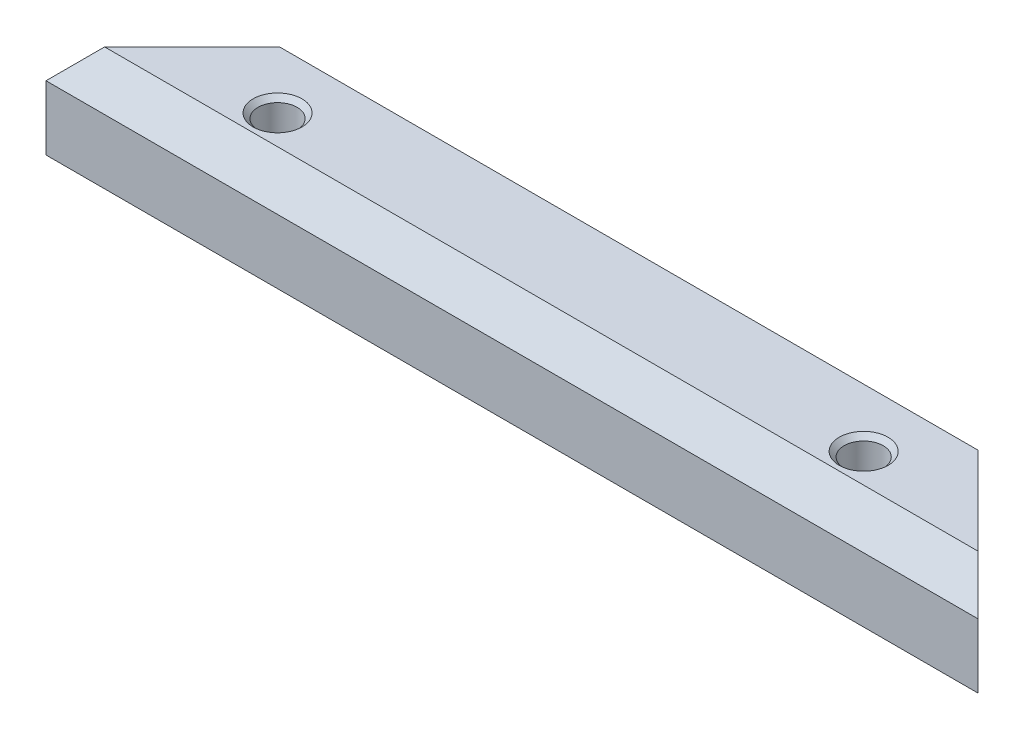
ISO-10303-21;
HEADER;
FILE_DESCRIPTION(('STEP AP214'),'2;1');
FILE_NAME('part.step','',(''),(''),'','','');
FILE_SCHEMA(('AUTOMOTIVE_DESIGN { 1 0 10303 214 1 1 1 1 }'));
ENDSEC;
DATA;
#1=APPLICATION_CONTEXT('core data for automotive mechanical design processes');
#2=APPLICATION_PROTOCOL_DEFINITION('international standard','automotive_design',2000,#1);
#3=PRODUCT_CONTEXT('',#1,'mechanical');
#4=PRODUCT('Part','Part','',(#3));
#5=PRODUCT_RELATED_PRODUCT_CATEGORY('part','',(#4));
#6=PRODUCT_DEFINITION_FORMATION('','',#4);
#7=PRODUCT_DEFINITION_CONTEXT('part definition',#1,'design');
#8=PRODUCT_DEFINITION('design','',#6,#7);
#9=PRODUCT_DEFINITION_SHAPE('','',#8);
#10=(LENGTH_UNIT() NAMED_UNIT(*) SI_UNIT(.MILLI.,.METRE.));
#11=(NAMED_UNIT(*) PLANE_ANGLE_UNIT() SI_UNIT($,.RADIAN.));
#12=(NAMED_UNIT(*) SI_UNIT($,.STERADIAN.) SOLID_ANGLE_UNIT());
#13=UNCERTAINTY_MEASURE_WITH_UNIT(LENGTH_MEASURE(1.E-05),#10,'distance_accuracy_value','');
#14=(GEOMETRIC_REPRESENTATION_CONTEXT(3) GLOBAL_UNCERTAINTY_ASSIGNED_CONTEXT((#13)) GLOBAL_UNIT_ASSIGNED_CONTEXT((#10,
#11,#12)) REPRESENTATION_CONTEXT('',''));
#15=CARTESIAN_POINT('',(0.,0.,0.));
#16=DIRECTION('',(0.,0.,1.));
#17=DIRECTION('',(1.,0.,0.));
#18=AXIS2_PLACEMENT_3D('',#15,#16,#17);
#19=CARTESIAN_POINT('',(59.9999999999999,0.,-12.));
#20=DIRECTION('',(0.,1.,0.));
#21=DIRECTION('',(0.,0.,1.));
#22=AXIS2_PLACEMENT_3D('',#19,#20,#21);
#23=CYLINDRICAL_SURFACE('',#22,2.);
#24=CARTESIAN_POINT('',(59.9999999999999,12.,-12.));
#25=DIRECTION('',(0.,1.,0.));
#26=DIRECTION('',(0.,0.,1.));
#27=AXIS2_PLACEMENT_3D('',#24,#25,#26);
#28=CIRCLE('',#27,2.);
#29=CARTESIAN_POINT('',(59.9999999999999,12.,-10.));
#30=VERTEX_POINT('',#29);
#31=EDGE_CURVE('E143',#30,#30,#28,.F.);
#32=ORIENTED_EDGE('',*,*,#31,.F.);
#33=EDGE_LOOP('',(#32));
#34=FACE_BOUND('',#33,.T.);
#35=CARTESIAN_POINT('',(59.9999999999999,5.,-12.));
#36=DIRECTION('',(0.,-1.,0.));
#37=DIRECTION('',(0.,0.,-1.));
#38=AXIS2_PLACEMENT_3D('',#35,#36,#37);
#39=CIRCLE('',#38,2.);
#40=CARTESIAN_POINT('',(59.9999999999999,5.,-14.));
#41=VERTEX_POINT('',#40);
#42=EDGE_CURVE('E219',#41,#41,#39,.F.);
#43=ORIENTED_EDGE('',*,*,#42,.F.);
#44=EDGE_LOOP('',(#43));
#45=FACE_BOUND('',#44,.T.);
#46=ADVANCED_FACE('F41',(#34,#45),#23,.F.);
#47=CARTESIAN_POINT('',(-59.9999999999999,0.,-12.));
#48=DIRECTION('',(0.,1.,0.));
#49=DIRECTION('',(0.,0.,1.));
#50=AXIS2_PLACEMENT_3D('',#47,#48,#49);
#51=CYLINDRICAL_SURFACE('',#50,2.);
#52=CARTESIAN_POINT('',(-59.9999999999999,12.,-12.));
#53=DIRECTION('',(0.,1.,0.));
#54=DIRECTION('',(0.,0.,1.));
#55=AXIS2_PLACEMENT_3D('',#52,#53,#54);
#56=CIRCLE('',#55,2.);
#57=CARTESIAN_POINT('',(-59.9999999999999,12.,-10.));
#58=VERTEX_POINT('',#57);
#59=EDGE_CURVE('E149',#58,#58,#56,.F.);
#60=ORIENTED_EDGE('',*,*,#59,.F.);
#61=EDGE_LOOP('',(#60));
#62=FACE_BOUND('',#61,.T.);
#63=CARTESIAN_POINT('',(-59.9999999999999,5.,-12.));
#64=DIRECTION('',(0.,-1.,0.));
#65=DIRECTION('',(0.,0.,-1.));
#66=AXIS2_PLACEMENT_3D('',#63,#64,#65);
#67=CIRCLE('',#66,2.);
#68=CARTESIAN_POINT('',(-59.9999999999999,5.,-14.));
#69=VERTEX_POINT('',#68);
#70=EDGE_CURVE('E216',#69,#69,#67,.F.);
#71=ORIENTED_EDGE('',*,*,#70,.F.);
#72=EDGE_LOOP('',(#71));
#73=FACE_BOUND('',#72,.T.);
#74=ADVANCED_FACE('F252',(#62,#73),#51,.F.);
#75=CARTESIAN_POINT('',(69.5,3.,-25.91));
#76=DIRECTION('',(-0.707106781186549,0.,0.707106781186546));
#77=DIRECTION('',(0.707106781186546,0.,0.707106781186549));
#78=AXIS2_PLACEMENT_3D('',#75,#76,#77);
#79=PLANE('',#78);
#80=DIRECTION('',(0.,-1.,0.));
#81=VECTOR('',#80,1.);
#82=CARTESIAN_POINT('',(69.5,3.,-25.91));
#83=LINE('',#82,#81);
#84=CARTESIAN_POINT('',(69.5,17.17,-25.91));
#85=VERTEX_POINT('',#84);
#86=CARTESIAN_POINT('',(69.5,0.,-25.91));
#87=VERTEX_POINT('',#86);
#88=EDGE_CURVE('E188',#85,#87,#83,.T.);
#89=ORIENTED_EDGE('',*,*,#88,.F.);
#90=DIRECTION('',(-0.577350269189622,-0.577350269189632,-0.577350269189624));
#91=VECTOR('',#90,1.);
#92=CARTESIAN_POINT('',(47.666666666667,-4.66333333333342,-47.7433333333331));
#93=LINE('',#92,#91);
#94=CARTESIAN_POINT('',(71.5,19.17,-23.91));
#95=VERTEX_POINT('',#94);
#96=EDGE_CURVE('E12',#85,#95,#93,.F.);
#97=ORIENTED_EDGE('',*,*,#96,.T.);
#98=DIRECTION('',(-0.707106781186546,0.,-0.707106781186549));
#99=VECTOR('',#98,1.);
#100=CARTESIAN_POINT('',(69.5,19.17,-25.91));
#101=LINE('',#100,#99);
#102=CARTESIAN_POINT('',(89.4099999999999,19.17,-6.));
#103=VERTEX_POINT('',#102);
#104=EDGE_CURVE('E142',#103,#95,#101,.T.);
#105=ORIENTED_EDGE('',*,*,#104,.F.);
#106=DIRECTION('',(-0.577350269189624,0.577350269189628,-0.577350269189626));
#107=VECTOR('',#106,1.);
#108=CARTESIAN_POINT('',(59.6066666666669,48.9733333333333,-35.8033333333332));
#109=LINE('',#108,#107);
#110=CARTESIAN_POINT('',(95.4099999999999,13.17,0.));
#111=VERTEX_POINT('',#110);
#112=EDGE_CURVE('E193',#103,#111,#109,.F.);
#113=ORIENTED_EDGE('',*,*,#112,.T.);
#114=DIRECTION('',(0.,-1.,0.));
#115=VECTOR('',#114,1.);
#116=CARTESIAN_POINT('',(95.4099999999999,3.,0.));
#117=LINE('',#116,#115);
#118=CARTESIAN_POINT('',(95.4099999999999,0.,0.));
#119=VERTEX_POINT('',#118);
#120=EDGE_CURVE('E171',#111,#119,#117,.T.);
#121=ORIENTED_EDGE('',*,*,#120,.T.);
#122=DIRECTION('',(-0.707106781186546,0.,-0.707106781186549));
#123=VECTOR('',#122,1.);
#124=CARTESIAN_POINT('',(69.5,0.,-25.91));
#125=LINE('',#124,#123);
#126=EDGE_CURVE('E168',#119,#87,#125,.T.);
#127=ORIENTED_EDGE('',*,*,#126,.T.);
#128=EDGE_LOOP('',(#89,#97,#105,#113,#121,#127));
#129=FACE_BOUND('',#128,.T.);
#130=ADVANCED_FACE('F240',(#129),#79,.F.);
#131=CARTESIAN_POINT('',(-69.5,3.,-25.91));
#132=DIRECTION('',(0.,0.,1.));
#133=DIRECTION('',(1.,0.,0.));
#134=AXIS2_PLACEMENT_3D('',#131,#132,#133);
#135=PLANE('',#134);
#136=DIRECTION('',(0.,-1.,0.));
#137=VECTOR('',#136,1.);
#138=CARTESIAN_POINT('',(64.4969448888859,15.,-25.91));
#139=LINE('',#138,#137);
#140=CARTESIAN_POINT('',(64.4969448888859,15.,-25.91));
#141=VERTEX_POINT('',#140);
#142=CARTESIAN_POINT('',(64.496944888886,3.,-25.91));
#143=VERTEX_POINT('',#142);
#144=EDGE_CURVE('E140',#141,#143,#139,.T.);
#145=ORIENTED_EDGE('',*,*,#144,.F.);
#146=DIRECTION('',(-1.,0.,0.));
#147=VECTOR('',#146,1.);
#148=CARTESIAN_POINT('',(-69.5,15.,-25.91));
#149=LINE('',#148,#147);
#150=CARTESIAN_POINT('',(-64.496944888886,15.,-25.91));
#151=VERTEX_POINT('',#150);
#152=EDGE_CURVE('E134',#141,#151,#149,.T.);
#153=ORIENTED_EDGE('',*,*,#152,.T.);
#154=DIRECTION('',(0.,-1.,0.));
#155=VECTOR('',#154,1.);
#156=CARTESIAN_POINT('',(-64.496944888886,15.,-25.91));
#157=LINE('',#156,#155);
#158=CARTESIAN_POINT('',(-64.496944888886,3.,-25.91));
#159=VERTEX_POINT('',#158);
#160=EDGE_CURVE('E118',#151,#159,#157,.T.);
#161=ORIENTED_EDGE('',*,*,#160,.T.);
#162=DIRECTION('',(-1.,0.,0.));
#163=VECTOR('',#162,1.);
#164=CARTESIAN_POINT('',(-69.5,3.,-25.91));
#165=LINE('',#164,#163);
#166=EDGE_CURVE('E169',#143,#159,#165,.T.);
#167=ORIENTED_EDGE('',*,*,#166,.F.);
#168=EDGE_LOOP('',(#145,#153,#161,#167));
#169=FACE_BOUND('',#168,.T.);
#170=DIRECTION('',(0.,-1.,0.));
#171=VECTOR('',#170,1.);
#172=CARTESIAN_POINT('',(-69.5,3.,-25.91));
#173=LINE('',#172,#171);
#174=CARTESIAN_POINT('',(-69.5,17.17,-25.91));
#175=VERTEX_POINT('',#174);
#176=CARTESIAN_POINT('',(-69.5,0.,-25.91));
#177=VERTEX_POINT('',#176);
#178=EDGE_CURVE('E186',#175,#177,#173,.T.);
#179=ORIENTED_EDGE('',*,*,#178,.F.);
#180=DIRECTION('',(1.,0.,0.));
#181=VECTOR('',#180,1.);
#182=CARTESIAN_POINT('',(-69.5,17.17,-25.91));
#183=LINE('',#182,#181);
#184=EDGE_CURVE('E50',#175,#85,#183,.T.);
#185=ORIENTED_EDGE('',*,*,#184,.T.);
#186=ORIENTED_EDGE('',*,*,#88,.T.);
#187=DIRECTION('',(-1.,0.,0.));
#188=VECTOR('',#187,1.);
#189=CARTESIAN_POINT('',(-69.5,0.,-25.91));
#190=LINE('',#189,#188);
#191=EDGE_CURVE('E175',#87,#177,#190,.T.);
#192=ORIENTED_EDGE('',*,*,#191,.T.);
#193=EDGE_LOOP('',(#179,#185,#186,#192));
#194=FACE_BOUND('',#193,.T.);
#195=ADVANCED_FACE('F138',(#169,#194),#135,.F.);
#196=CARTESIAN_POINT('',(-95.4099999999999,3.,0.));
#197=DIRECTION('',(0.707106781186549,0.,0.707106781186546));
#198=DIRECTION('',(0.707106781186546,0.,-0.707106781186549));
#199=AXIS2_PLACEMENT_3D('',#196,#197,#198);
#200=PLANE('',#199);
#201=DIRECTION('',(-0.707106781186546,0.,0.707106781186549));
#202=VECTOR('',#201,1.);
#203=CARTESIAN_POINT('',(-95.4099999999999,19.17,0.));
#204=LINE('',#203,#202);
#205=CARTESIAN_POINT('',(-71.5,19.17,-23.91));
#206=VERTEX_POINT('',#205);
#207=CARTESIAN_POINT('',(-89.4099999999999,19.17,-6.));
#208=VERTEX_POINT('',#207);
#209=EDGE_CURVE('E146',#206,#208,#204,.T.);
#210=ORIENTED_EDGE('',*,*,#209,.F.);
#211=DIRECTION('',(-0.577350269189622,0.577350269189632,0.577350269189624));
#212=VECTOR('',#211,1.);
#213=CARTESIAN_POINT('',(-47.666666666667,-4.66333333333341,-47.7433333333331));
#214=LINE('',#213,#212);
#215=EDGE_CURVE('E64',#206,#175,#214,.F.);
#216=ORIENTED_EDGE('',*,*,#215,.T.);
#217=ORIENTED_EDGE('',*,*,#178,.T.);
#218=DIRECTION('',(-0.707106781186546,0.,0.707106781186549));
#219=VECTOR('',#218,1.);
#220=CARTESIAN_POINT('',(-95.4099999999999,0.,0.));
#221=LINE('',#220,#219);
#222=CARTESIAN_POINT('',(-95.4099999999999,0.,0.));
#223=VERTEX_POINT('',#222);
#224=EDGE_CURVE('E178',#177,#223,#221,.T.);
#225=ORIENTED_EDGE('',*,*,#224,.T.);
#226=DIRECTION('',(0.,-1.,0.));
#227=VECTOR('',#226,1.);
#228=CARTESIAN_POINT('',(-95.4099999999999,3.,0.));
#229=LINE('',#228,#227);
#230=CARTESIAN_POINT('',(-95.4099999999999,13.17,0.));
#231=VERTEX_POINT('',#230);
#232=EDGE_CURVE('E184',#231,#223,#229,.T.);
#233=ORIENTED_EDGE('',*,*,#232,.F.);
#234=DIRECTION('',(-0.577350269189624,-0.577350269189628,0.577350269189626));
#235=VECTOR('',#234,1.);
#236=CARTESIAN_POINT('',(-59.6066666666669,48.9733333333333,-35.8033333333332));
#237=LINE('',#236,#235);
#238=EDGE_CURVE('E197',#231,#208,#237,.F.);
#239=ORIENTED_EDGE('',*,*,#238,.T.);
#240=EDGE_LOOP('',(#210,#216,#217,#225,#233,#239));
#241=FACE_BOUND('',#240,.T.);
#242=ADVANCED_FACE('F232',(#241),#200,.F.);
#243=CARTESIAN_POINT('',(-95.4099999999999,3.,0.));
#244=DIRECTION('',(0.,0.,-1.));
#245=DIRECTION('',(-1.,0.,0.));
#246=AXIS2_PLACEMENT_3D('',#243,#244,#245);
#247=PLANE('',#246);
#248=ORIENTED_EDGE('',*,*,#120,.F.);
#249=DIRECTION('',(-1.,0.,0.));
#250=VECTOR('',#249,1.);
#251=CARTESIAN_POINT('',(-95.4099999999999,13.17,0.));
#252=LINE('',#251,#250);
#253=EDGE_CURVE('E195',#111,#231,#252,.T.);
#254=ORIENTED_EDGE('',*,*,#253,.T.);
#255=ORIENTED_EDGE('',*,*,#232,.T.);
#256=DIRECTION('',(1.,0.,0.));
#257=VECTOR('',#256,1.);
#258=CARTESIAN_POINT('',(-95.4099999999999,0.,0.));
#259=LINE('',#258,#257);
#260=EDGE_CURVE('E172',#223,#119,#259,.T.);
#261=ORIENTED_EDGE('',*,*,#260,.T.);
#262=EDGE_LOOP('',(#248,#254,#255,#261));
#263=FACE_BOUND('',#262,.T.);
#264=ADVANCED_FACE('F283',(#263),#247,.F.);
#265=CARTESIAN_POINT('',(0.,3.,0.));
#266=DIRECTION('',(0.,1.,0.));
#267=DIRECTION('',(0.,0.,1.));
#268=AXIS2_PLACEMENT_3D('',#265,#266,#267);
#269=PLANE('',#268);
#270=CARTESIAN_POINT('',(-64.496944888886,3.,24.09));
#271=DIRECTION('',(0.,1.,0.));
#272=DIRECTION('',(0.,0.,1.));
#273=AXIS2_PLACEMENT_3D('',#270,#271,#272);
#274=CIRCLE('',#273,50.);
#275=CARTESIAN_POINT('',(-45.5272552156842,3.,-22.1717647058823));
#276=VERTEX_POINT('',#275);
#277=EDGE_CURVE('E124',#276,#159,#274,.T.);
#278=ORIENTED_EDGE('',*,*,#277,.F.);
#279=CARTESIAN_POINT('',(0.,3.,-133.2));
#280=DIRECTION('',(0.,-1.,0.));
#281=DIRECTION('',(0.,0.,1.));
#282=AXIS2_PLACEMENT_3D('',#279,#280,#281);
#283=CIRCLE('',#282,120.);
#284=CARTESIAN_POINT('',(45.5272552156842,3.,-22.1717647058823));
#285=VERTEX_POINT('',#284);
#286=EDGE_CURVE('E159',#285,#276,#283,.T.);
#287=ORIENTED_EDGE('',*,*,#286,.F.);
#288=CARTESIAN_POINT('',(64.4969448888859,3.,24.09));
#289=DIRECTION('',(0.,1.,0.));
#290=DIRECTION('',(0.,0.,-1.));
#291=AXIS2_PLACEMENT_3D('',#288,#289,#290);
#292=CIRCLE('',#291,50.);
#293=EDGE_CURVE('E156',#143,#285,#292,.T.);
#294=ORIENTED_EDGE('',*,*,#293,.F.);
#295=ORIENTED_EDGE('',*,*,#166,.T.);
#296=EDGE_LOOP('',(#278,#287,#294,#295));
#297=FACE_BOUND('',#296,.T.);
#298=ADVANCED_FACE('F280',(#297),#269,.T.);
#299=CARTESIAN_POINT('',(0.,0.,0.));
#300=DIRECTION('',(0.,1.,0.));
#301=DIRECTION('',(0.,0.,1.));
#302=AXIS2_PLACEMENT_3D('',#299,#300,#301);
#303=PLANE('',#302);
#304=CARTESIAN_POINT('',(-59.9999999999999,0.,-12.));
#305=DIRECTION('',(0.,-1.,0.));
#306=DIRECTION('',(0.,0.,-1.));
#307=AXIS2_PLACEMENT_3D('',#304,#305,#306);
#308=CIRCLE('',#307,4.00000000000001);
#309=CARTESIAN_POINT('',(-59.9999999999999,0.,-16.));
#310=VERTEX_POINT('',#309);
#311=EDGE_CURVE('E354',#310,#310,#308,.T.);
#312=ORIENTED_EDGE('',*,*,#311,.F.);
#313=EDGE_LOOP('',(#312));
#314=FACE_BOUND('',#313,.T.);
#315=CARTESIAN_POINT('',(-30.,0.,-12.));
#316=DIRECTION('',(0.,-1.,0.));
#317=DIRECTION('',(0.,0.,-1.));
#318=AXIS2_PLACEMENT_3D('',#315,#316,#317);
#319=CIRCLE('',#318,4.00000000000001);
#320=CARTESIAN_POINT('',(-30.,0.,-16.));
#321=VERTEX_POINT('',#320);
#322=EDGE_CURVE('E348',#321,#321,#319,.T.);
#323=ORIENTED_EDGE('',*,*,#322,.F.);
#324=EDGE_LOOP('',(#323));
#325=FACE_BOUND('',#324,.T.);
#326=CARTESIAN_POINT('',(30.,0.,-12.));
#327=DIRECTION('',(0.,-1.,0.));
#328=DIRECTION('',(0.,0.,-1.));
#329=AXIS2_PLACEMENT_3D('',#326,#327,#328);
#330=CIRCLE('',#329,4.);
#331=CARTESIAN_POINT('',(30.,0.,-16.));
#332=VERTEX_POINT('',#331);
#333=EDGE_CURVE('E342',#332,#332,#330,.T.);
#334=ORIENTED_EDGE('',*,*,#333,.F.);
#335=EDGE_LOOP('',(#334));
#336=FACE_BOUND('',#335,.T.);
#337=CARTESIAN_POINT('',(59.9999999999999,0.,-12.));
#338=DIRECTION('',(0.,-1.,0.));
#339=DIRECTION('',(0.,0.,-1.));
#340=AXIS2_PLACEMENT_3D('',#337,#338,#339);
#341=CIRCLE('',#340,4.00000000000001);
#342=CARTESIAN_POINT('',(59.9999999999999,0.,-16.));
#343=VERTEX_POINT('',#342);
#344=EDGE_CURVE('E336',#343,#343,#341,.T.);
#345=ORIENTED_EDGE('',*,*,#344,.F.);
#346=EDGE_LOOP('',(#345));
#347=FACE_BOUND('',#346,.T.);
#348=ORIENTED_EDGE('',*,*,#126,.F.);
#349=ORIENTED_EDGE('',*,*,#260,.F.);
#350=ORIENTED_EDGE('',*,*,#224,.F.);
#351=ORIENTED_EDGE('',*,*,#191,.F.);
#352=EDGE_LOOP('',(#348,#349,#350,#351));
#353=FACE_BOUND('',#352,.T.);
#354=ADVANCED_FACE('F278',(#314,#325,#336,#347,#353),#303,.F.);
#355=CARTESIAN_POINT('',(64.4969448888859,15.,24.09));
#356=DIRECTION('',(0.,-1.,0.));
#357=DIRECTION('',(0.,0.,-1.));
#358=AXIS2_PLACEMENT_3D('',#355,#356,#357);
#359=CYLINDRICAL_SURFACE('',#358,50.);
#360=ORIENTED_EDGE('',*,*,#293,.T.);
#361=DIRECTION('',(0.,-1.,0.));
#362=VECTOR('',#361,1.);
#363=CARTESIAN_POINT('',(45.5272552156842,15.,-22.1717647058823));
#364=LINE('',#363,#362);
#365=CARTESIAN_POINT('',(45.5272552156842,15.,-22.1717647058823));
#366=VERTEX_POINT('',#365);
#367=EDGE_CURVE('E164',#366,#285,#364,.T.);
#368=ORIENTED_EDGE('',*,*,#367,.F.);
#369=CARTESIAN_POINT('',(64.4969448888859,15.,24.09));
#370=DIRECTION('',(0.,1.,0.));
#371=DIRECTION('',(0.,0.,-1.));
#372=AXIS2_PLACEMENT_3D('',#369,#370,#371);
#373=CIRCLE('',#372,50.);
#374=EDGE_CURVE('E153',#141,#366,#373,.T.);
#375=ORIENTED_EDGE('',*,*,#374,.F.);
#376=ORIENTED_EDGE('',*,*,#144,.T.);
#377=EDGE_LOOP('',(#360,#368,#375,#376));
#378=FACE_BOUND('',#377,.T.);
#379=ADVANCED_FACE('F274',(#378),#359,.T.);
#380=CARTESIAN_POINT('',(0.,15.,-133.2));
#381=DIRECTION('',(0.,-1.,0.));
#382=DIRECTION('',(0.,0.,-1.));
#383=AXIS2_PLACEMENT_3D('',#380,#381,#382);
#384=CYLINDRICAL_SURFACE('',#383,120.);
#385=ORIENTED_EDGE('',*,*,#286,.T.);
#386=DIRECTION('',(0.,-1.,0.));
#387=VECTOR('',#386,1.);
#388=CARTESIAN_POINT('',(-45.5272552156842,15.,-22.1717647058823));
#389=LINE('',#388,#387);
#390=CARTESIAN_POINT('',(-45.5272552156842,15.,-22.1717647058823));
#391=VERTEX_POINT('',#390);
#392=EDGE_CURVE('E128',#391,#276,#389,.T.);
#393=ORIENTED_EDGE('',*,*,#392,.F.);
#394=CARTESIAN_POINT('',(0.,15.,-133.2));
#395=DIRECTION('',(0.,-1.,0.));
#396=DIRECTION('',(0.,0.,1.));
#397=AXIS2_PLACEMENT_3D('',#394,#395,#396);
#398=CIRCLE('',#397,120.);
#399=EDGE_CURVE('E136',#366,#391,#398,.T.);
#400=ORIENTED_EDGE('',*,*,#399,.F.);
#401=ORIENTED_EDGE('',*,*,#367,.T.);
#402=EDGE_LOOP('',(#385,#393,#400,#401));
#403=FACE_BOUND('',#402,.T.);
#404=ADVANCED_FACE('F271',(#403),#384,.F.);
#405=CARTESIAN_POINT('',(-64.496944888886,15.,24.09));
#406=DIRECTION('',(0.,-1.,0.));
#407=DIRECTION('',(0.,0.,-1.));
#408=AXIS2_PLACEMENT_3D('',#405,#406,#407);
#409=CYLINDRICAL_SURFACE('',#408,50.);
#410=ORIENTED_EDGE('',*,*,#277,.T.);
#411=ORIENTED_EDGE('',*,*,#160,.F.);
#412=CARTESIAN_POINT('',(-64.496944888886,15.,24.09));
#413=DIRECTION('',(0.,1.,0.));
#414=DIRECTION('',(0.,0.,1.));
#415=AXIS2_PLACEMENT_3D('',#412,#413,#414);
#416=CIRCLE('',#415,50.);
#417=EDGE_CURVE('E122',#391,#151,#416,.T.);
#418=ORIENTED_EDGE('',*,*,#417,.F.);
#419=ORIENTED_EDGE('',*,*,#392,.T.);
#420=EDGE_LOOP('',(#410,#411,#418,#419));
#421=FACE_BOUND('',#420,.T.);
#422=ADVANCED_FACE('F120',(#421),#409,.T.);
#423=CARTESIAN_POINT('',(0.,19.17,0.));
#424=DIRECTION('',(0.,-1.,0.));
#425=DIRECTION('',(0.,0.,-1.));
#426=AXIS2_PLACEMENT_3D('',#423,#424,#425);
#427=PLANE('',#426);
#428=CARTESIAN_POINT('',(-59.9999999999999,19.17,-12.));
#429=DIRECTION('',(0.,-1.,0.));
#430=DIRECTION('',(0.,0.,-1.));
#431=AXIS2_PLACEMENT_3D('',#428,#429,#430);
#432=CIRCLE('',#431,5.00000000000012);
#433=CARTESIAN_POINT('',(-59.9999999999999,19.17,-17.0000000000001));
#434=VERTEX_POINT('',#433);
#435=EDGE_CURVE('E209',#434,#434,#432,.T.);
#436=ORIENTED_EDGE('',*,*,#435,.T.);
#437=EDGE_LOOP('',(#436));
#438=FACE_BOUND('',#437,.T.);
#439=CARTESIAN_POINT('',(59.9999999999999,19.17,-12.));
#440=DIRECTION('',(0.,-1.,0.));
#441=DIRECTION('',(0.,0.,-1.));
#442=AXIS2_PLACEMENT_3D('',#439,#440,#441);
#443=CIRCLE('',#442,5.00000000000012);
#444=CARTESIAN_POINT('',(59.9999999999999,19.17,-17.0000000000001));
#445=VERTEX_POINT('',#444);
#446=EDGE_CURVE('E206',#445,#445,#443,.T.);
#447=ORIENTED_EDGE('',*,*,#446,.T.);
#448=EDGE_LOOP('',(#447));
#449=FACE_BOUND('',#448,.T.);
#450=ORIENTED_EDGE('',*,*,#104,.T.);
#451=DIRECTION('',(-1.,0.,0.));
#452=VECTOR('',#451,1.);
#453=CARTESIAN_POINT('',(0.,19.17,-23.91));
#454=LINE('',#453,#452);
#455=EDGE_CURVE('E215',#95,#206,#454,.T.);
#456=ORIENTED_EDGE('',*,*,#455,.T.);
#457=ORIENTED_EDGE('',*,*,#209,.T.);
#458=DIRECTION('',(1.,0.,0.));
#459=VECTOR('',#458,1.);
#460=CARTESIAN_POINT('',(0.,19.17,-5.99999999999999));
#461=LINE('',#460,#459);
#462=EDGE_CURVE('E190',#208,#103,#461,.T.);
#463=ORIENTED_EDGE('',*,*,#462,.T.);
#464=EDGE_LOOP('',(#450,#456,#457,#463));
#465=FACE_BOUND('',#464,.T.);
#466=ADVANCED_FACE('F228',(#438,#449,#465),#427,.F.);
#467=CARTESIAN_POINT('',(0.,15.,0.));
#468=DIRECTION('',(0.,-1.,0.));
#469=DIRECTION('',(0.,0.,-1.));
#470=AXIS2_PLACEMENT_3D('',#467,#468,#469);
#471=PLANE('',#470);
#472=ORIENTED_EDGE('',*,*,#152,.F.);
#473=ORIENTED_EDGE('',*,*,#374,.T.);
#474=ORIENTED_EDGE('',*,*,#399,.T.);
#475=ORIENTED_EDGE('',*,*,#417,.T.);
#476=EDGE_LOOP('',(#472,#473,#474,#475));
#477=FACE_BOUND('',#476,.T.);
#478=ADVANCED_FACE('F132',(#477),#471,.T.);
#479=CARTESIAN_POINT('',(0.,19.17,-5.99999999999999));
#480=DIRECTION('',(0.,-0.707106781186546,-0.707106781186549));
#481=DIRECTION('',(1.,0.,0.));
#482=AXIS2_PLACEMENT_3D('',#479,#480,#481);
#483=PLANE('',#482);
#484=ORIENTED_EDGE('',*,*,#238,.F.);
#485=ORIENTED_EDGE('',*,*,#253,.F.);
#486=ORIENTED_EDGE('',*,*,#112,.F.);
#487=ORIENTED_EDGE('',*,*,#462,.F.);
#488=EDGE_LOOP('',(#484,#485,#486,#487));
#489=FACE_BOUND('',#488,.T.);
#490=ADVANCED_FACE('F238',(#489),#483,.F.);
#491=CARTESIAN_POINT('',(0.,12.,0.));
#492=DIRECTION('',(0.,1.,0.));
#493=DIRECTION('',(0.,0.,1.));
#494=AXIS2_PLACEMENT_3D('',#491,#492,#493);
#495=PLANE('',#494);
#496=CARTESIAN_POINT('',(-59.9999999999999,12.,-12.));
#497=DIRECTION('',(0.,1.,0.));
#498=DIRECTION('',(0.,0.,1.));
#499=AXIS2_PLACEMENT_3D('',#496,#497,#498);
#500=CIRCLE('',#499,4.00000000000001);
#501=CARTESIAN_POINT('',(-59.9999999999999,12.,-8.00000000000001));
#502=VERTEX_POINT('',#501);
#503=EDGE_CURVE('E202',#502,#502,#500,.F.);
#504=ORIENTED_EDGE('',*,*,#503,.F.);
#505=EDGE_LOOP('',(#504));
#506=FACE_BOUND('',#505,.T.);
#507=ORIENTED_EDGE('',*,*,#59,.T.);
#508=EDGE_LOOP('',(#507));
#509=FACE_BOUND('',#508,.T.);
#510=ADVANCED_FACE('F303',(#506,#509),#495,.T.);
#511=CARTESIAN_POINT('',(-59.9999999999999,-11.3137084989848,-12.));
#512=DIRECTION('',(0.,1.,0.));
#513=DIRECTION('',(0.,0.,1.));
#514=AXIS2_PLACEMENT_3D('',#511,#512,#513);
#515=CYLINDRICAL_SURFACE('',#514,4.00000000000001);
#516=CARTESIAN_POINT('',(-59.9999999999999,18.1699999999999,-12.));
#517=DIRECTION('',(0.,-1.,0.));
#518=DIRECTION('',(0.,0.,-1.));
#519=AXIS2_PLACEMENT_3D('',#516,#517,#518);
#520=CIRCLE('',#519,4.00000000000001);
#521=CARTESIAN_POINT('',(-59.9999999999999,18.1699999999999,-8.00000000000001));
#522=VERTEX_POINT('',#521);
#523=EDGE_CURVE('E200',#522,#522,#520,.F.);
#524=CARTESIAN_POINT('',(-59.9999999999999,18.1699999999999,-8.00000000000001));
#525=CARTESIAN_POINT('',(-59.9999999999999,18.1057291666666,-8.00000000000001));
#526=CARTESIAN_POINT('',(-59.9999999999999,18.0414583333332,-8.00000000000001));
#527=CARTESIAN_POINT('',(-59.9999999999999,17.9129166666666,-8.00000000000001));
#528=CARTESIAN_POINT('',(-59.9999999999999,17.8486458333333,-8.00000000000001));
#529=CARTESIAN_POINT('',(-59.9999999999999,17.7201041666666,-8.00000000000001));
#530=CARTESIAN_POINT('',(-59.9999999999999,17.6558333333333,-8.00000000000001));
#531=CARTESIAN_POINT('',(-59.9999999999999,17.5272916666666,-8.00000000000001));
#532=CARTESIAN_POINT('',(-59.9999999999999,17.4630208333333,-8.00000000000001));
#533=CARTESIAN_POINT('',(-59.9999999999999,17.3344791666666,-8.00000000000001));
#534=CARTESIAN_POINT('',(-59.9999999999999,17.2702083333333,-8.00000000000001));
#535=CARTESIAN_POINT('',(-59.9999999999999,17.1416666666666,-8.00000000000001));
#536=CARTESIAN_POINT('',(-59.9999999999999,17.0773958333333,-8.00000000000001));
#537=CARTESIAN_POINT('',(-59.9999999999999,16.9488541666666,-8.00000000000001));
#538=CARTESIAN_POINT('',(-59.9999999999999,16.8845833333333,-8.00000000000001));
#539=CARTESIAN_POINT('',(-59.9999999999999,16.7560416666666,-8.00000000000001));
#540=CARTESIAN_POINT('',(-59.9999999999999,16.6917708333333,-8.00000000000001));
#541=CARTESIAN_POINT('',(-59.9999999999999,16.5632291666666,-8.00000000000001));
#542=CARTESIAN_POINT('',(-59.9999999999999,16.4989583333333,-8.00000000000001));
#543=CARTESIAN_POINT('',(-59.9999999999999,16.3704166666666,-8.00000000000001));
#544=CARTESIAN_POINT('',(-59.9999999999999,16.3061458333333,-8.00000000000001));
#545=CARTESIAN_POINT('',(-59.9999999999999,16.1776041666666,-8.00000000000001));
#546=CARTESIAN_POINT('',(-59.9999999999999,16.1133333333333,-8.00000000000001));
#547=CARTESIAN_POINT('',(-59.9999999999999,15.9847916666666,-8.00000000000001));
#548=CARTESIAN_POINT('',(-59.9999999999999,15.9205208333333,-8.00000000000001));
#549=CARTESIAN_POINT('',(-59.9999999999999,15.7919791666666,-8.00000000000001));
#550=CARTESIAN_POINT('',(-59.9999999999999,15.7277083333333,-8.00000000000001));
#551=CARTESIAN_POINT('',(-59.9999999999999,15.5991666666666,-8.00000000000001));
#552=CARTESIAN_POINT('',(-59.9999999999999,15.5348958333333,-8.00000000000001));
#553=CARTESIAN_POINT('',(-59.9999999999999,15.4063541666666,-8.00000000000001));
#554=CARTESIAN_POINT('',(-59.9999999999999,15.3420833333333,-8.00000000000001));
#555=CARTESIAN_POINT('',(-59.9999999999999,15.2135416666666,-8.00000000000001));
#556=CARTESIAN_POINT('',(-59.9999999999999,15.1492708333333,-8.00000000000001));
#557=CARTESIAN_POINT('',(-59.9999999999999,15.0207291666666,-8.00000000000001));
#558=CARTESIAN_POINT('',(-59.9999999999999,14.9564583333333,-8.00000000000001));
#559=CARTESIAN_POINT('',(-59.9999999999999,14.8279166666666,-8.00000000000001));
#560=CARTESIAN_POINT('',(-59.9999999999999,14.7636458333333,-8.00000000000001));
#561=CARTESIAN_POINT('',(-59.9999999999999,14.6351041666666,-8.00000000000001));
#562=CARTESIAN_POINT('',(-59.9999999999999,14.5708333333333,-8.00000000000001));
#563=CARTESIAN_POINT('',(-59.9999999999999,14.4422916666666,-8.00000000000001));
#564=CARTESIAN_POINT('',(-59.9999999999999,14.3780208333333,-8.00000000000001));
#565=CARTESIAN_POINT('',(-59.9999999999999,14.2494791666666,-8.00000000000001));
#566=CARTESIAN_POINT('',(-59.9999999999999,14.1852083333333,-8.00000000000001));
#567=CARTESIAN_POINT('',(-59.9999999999999,14.0566666666666,-8.00000000000001));
#568=CARTESIAN_POINT('',(-59.9999999999999,13.9923958333333,-8.00000000000001));
#569=CARTESIAN_POINT('',(-59.9999999999999,13.8638541666666,-8.00000000000001));
#570=CARTESIAN_POINT('',(-59.9999999999999,13.7995833333333,-8.00000000000001));
#571=CARTESIAN_POINT('',(-59.9999999999999,13.6710416666666,-8.00000000000001));
#572=CARTESIAN_POINT('',(-59.9999999999999,13.6067708333333,-8.00000000000001));
#573=CARTESIAN_POINT('',(-59.9999999999999,13.4782291666666,-8.00000000000001));
#574=CARTESIAN_POINT('',(-59.9999999999999,13.4139583333333,-8.00000000000001));
#575=CARTESIAN_POINT('',(-59.9999999999999,13.2854166666666,-8.00000000000001));
#576=CARTESIAN_POINT('',(-59.9999999999999,13.2211458333333,-8.00000000000001));
#577=CARTESIAN_POINT('',(-59.9999999999999,13.0926041666667,-8.00000000000001));
#578=CARTESIAN_POINT('',(-59.9999999999999,13.0283333333333,-8.00000000000001));
#579=CARTESIAN_POINT('',(-59.9999999999999,12.8997916666667,-8.00000000000001));
#580=CARTESIAN_POINT('',(-59.9999999999999,12.8355208333333,-8.00000000000001));
#581=CARTESIAN_POINT('',(-59.9999999999999,12.7069791666667,-8.00000000000001));
#582=CARTESIAN_POINT('',(-59.9999999999999,12.6427083333333,-8.00000000000001));
#583=CARTESIAN_POINT('',(-59.9999999999999,12.5141666666667,-8.00000000000001));
#584=CARTESIAN_POINT('',(-59.9999999999999,12.4498958333333,-8.00000000000001));
#585=CARTESIAN_POINT('',(-59.9999999999999,12.3213541666667,-8.00000000000001));
#586=CARTESIAN_POINT('',(-59.9999999999999,12.2570833333333,-8.00000000000001));
#587=CARTESIAN_POINT('',(-59.9999999999999,12.1285416666667,-8.00000000000001));
#588=CARTESIAN_POINT('',(-59.9999999999999,12.0642708333333,-8.00000000000001));
#589=CARTESIAN_POINT('',(-59.9999999999999,12.,-8.00000000000001));
#590=B_SPLINE_CURVE_WITH_KNOTS('',3,(#524,#525,#526,#527,#528,#529,#530,#531,#532,#533,#534,
#535,#536,#537,#538,#539,#540,#541,#542,#543,#544,#545,#546,#547,#548,#549,#550,#551,#552,#553,
#554,#555,#556,#557,#558,#559,#560,#561,#562,#563,#564,#565,#566,#567,#568,#569,#570,#571,#572,
#573,#574,#575,#576,#577,#578,#579,#580,#581,#582,#583,#584,#585,#586,#587,#588,#589),
.UNSPECIFIED.,.F.,.F.,(4,2,2,2,2,2,2,2,2,2,2,2,2,2,2,2,2,2,2,2,2,2,2,2,2,2,2,2,2,2,2,2,4),(0.,
0.192812499999997,0.385624999999994,0.57843749999999,0.771249999999987,0.964062499999987,
1.15687499999998,1.34968749999998,1.54249999999998,1.73531249999997,1.92812499999997,
2.12093749999997,2.31374999999997,2.50656249999997,2.69937499999996,2.89218749999996,
3.08499999999996,3.27781249999995,3.47062499999995,3.66343749999995,3.85624999999994,
4.04906249999994,4.24187499999994,4.43468749999994,4.62749999999993,4.82031249999993,
5.01312499999993,5.20593749999992,5.39874999999992,5.59156249999992,5.78437499999992,
5.97718749999992,6.16999999999991),.UNSPECIFIED.);
#591=EDGE_CURVE('BSEAM389',#522,#502,#590,.T.);
#592=ORIENTED_EDGE('',*,*,#523,.T.);
#593=ORIENTED_EDGE('',*,*,#503,.T.);
#594=ORIENTED_EDGE('',*,*,#591,.T.);
#595=ORIENTED_EDGE('',*,*,#591,.F.);
#596=EDGE_LOOP('',(#592,#594,#593,#595));
#597=FACE_BOUND('',#596,.T.);
#598=ADVANCED_FACE('F389',(#597),#515,.F.);
#599=CARTESIAN_POINT('',(0.,12.,0.));
#600=DIRECTION('',(0.,1.,0.));
#601=DIRECTION('',(0.,0.,1.));
#602=AXIS2_PLACEMENT_3D('',#599,#600,#601);
#603=PLANE('',#602);
#604=CARTESIAN_POINT('',(59.9999999999999,12.,-12.));
#605=DIRECTION('',(0.,1.,0.));
#606=DIRECTION('',(0.,0.,1.));
#607=AXIS2_PLACEMENT_3D('',#604,#605,#606);
#608=CIRCLE('',#607,4.00000000000001);
#609=CARTESIAN_POINT('',(59.9999999999999,12.,-8.00000000000001));
#610=VERTEX_POINT('',#609);
#611=EDGE_CURVE('E223',#610,#610,#608,.F.);
#612=ORIENTED_EDGE('',*,*,#611,.F.);
#613=EDGE_LOOP('',(#612));
#614=FACE_BOUND('',#613,.T.);
#615=ORIENTED_EDGE('',*,*,#31,.T.);
#616=EDGE_LOOP('',(#615));
#617=FACE_BOUND('',#616,.T.);
#618=ADVANCED_FACE('F328',(#614,#617),#603,.T.);
#619=CARTESIAN_POINT('',(59.9999999999999,-11.3137084989848,-12.));
#620=DIRECTION('',(0.,1.,0.));
#621=DIRECTION('',(0.,0.,1.));
#622=AXIS2_PLACEMENT_3D('',#619,#620,#621);
#623=CYLINDRICAL_SURFACE('',#622,4.00000000000001);
#624=CARTESIAN_POINT('',(59.9999999999999,18.1699999999999,-12.));
#625=DIRECTION('',(0.,-1.,0.));
#626=DIRECTION('',(0.,0.,-1.));
#627=AXIS2_PLACEMENT_3D('',#624,#625,#626);
#628=CIRCLE('',#627,4.00000000000001);
#629=CARTESIAN_POINT('',(59.9999999999999,18.1699999999999,-8.00000000000001));
#630=VERTEX_POINT('',#629);
#631=EDGE_CURVE('E212',#630,#630,#628,.F.);
#632=CARTESIAN_POINT('',(59.9999999999999,18.1699999999999,-8.00000000000001));
#633=CARTESIAN_POINT('',(59.9999999999999,18.1057291666666,-8.00000000000001));
#634=CARTESIAN_POINT('',(59.9999999999999,18.0414583333332,-8.00000000000001));
#635=CARTESIAN_POINT('',(59.9999999999999,17.9129166666666,-8.00000000000001));
#636=CARTESIAN_POINT('',(59.9999999999999,17.8486458333333,-8.00000000000001));
#637=CARTESIAN_POINT('',(59.9999999999999,17.7201041666666,-8.00000000000001));
#638=CARTESIAN_POINT('',(59.9999999999999,17.6558333333333,-8.00000000000001));
#639=CARTESIAN_POINT('',(59.9999999999999,17.5272916666666,-8.00000000000001));
#640=CARTESIAN_POINT('',(59.9999999999999,17.4630208333333,-8.00000000000001));
#641=CARTESIAN_POINT('',(59.9999999999999,17.3344791666666,-8.00000000000001));
#642=CARTESIAN_POINT('',(59.9999999999999,17.2702083333333,-8.00000000000001));
#643=CARTESIAN_POINT('',(59.9999999999999,17.1416666666666,-8.00000000000001));
#644=CARTESIAN_POINT('',(59.9999999999999,17.0773958333333,-8.00000000000001));
#645=CARTESIAN_POINT('',(59.9999999999999,16.9488541666666,-8.00000000000001));
#646=CARTESIAN_POINT('',(59.9999999999999,16.8845833333333,-8.00000000000001));
#647=CARTESIAN_POINT('',(59.9999999999999,16.7560416666666,-8.00000000000001));
#648=CARTESIAN_POINT('',(59.9999999999999,16.6917708333333,-8.00000000000001));
#649=CARTESIAN_POINT('',(59.9999999999999,16.5632291666666,-8.00000000000001));
#650=CARTESIAN_POINT('',(59.9999999999999,16.4989583333333,-8.00000000000001));
#651=CARTESIAN_POINT('',(59.9999999999999,16.3704166666666,-8.00000000000001));
#652=CARTESIAN_POINT('',(59.9999999999999,16.3061458333333,-8.00000000000001));
#653=CARTESIAN_POINT('',(59.9999999999999,16.1776041666666,-8.00000000000001));
#654=CARTESIAN_POINT('',(59.9999999999999,16.1133333333333,-8.00000000000001));
#655=CARTESIAN_POINT('',(59.9999999999999,15.9847916666666,-8.00000000000001));
#656=CARTESIAN_POINT('',(59.9999999999999,15.9205208333333,-8.00000000000001));
#657=CARTESIAN_POINT('',(59.9999999999999,15.7919791666666,-8.00000000000001));
#658=CARTESIAN_POINT('',(59.9999999999999,15.7277083333333,-8.00000000000001));
#659=CARTESIAN_POINT('',(59.9999999999999,15.5991666666666,-8.00000000000001));
#660=CARTESIAN_POINT('',(59.9999999999999,15.5348958333333,-8.00000000000001));
#661=CARTESIAN_POINT('',(59.9999999999999,15.4063541666666,-8.00000000000001));
#662=CARTESIAN_POINT('',(59.9999999999999,15.3420833333333,-8.00000000000001));
#663=CARTESIAN_POINT('',(59.9999999999999,15.2135416666666,-8.00000000000001));
#664=CARTESIAN_POINT('',(59.9999999999999,15.1492708333333,-8.00000000000001));
#665=CARTESIAN_POINT('',(59.9999999999999,15.0207291666666,-8.00000000000001));
#666=CARTESIAN_POINT('',(59.9999999999999,14.9564583333333,-8.00000000000001));
#667=CARTESIAN_POINT('',(59.9999999999999,14.8279166666666,-8.00000000000001));
#668=CARTESIAN_POINT('',(59.9999999999999,14.7636458333333,-8.00000000000001));
#669=CARTESIAN_POINT('',(59.9999999999999,14.6351041666666,-8.00000000000001));
#670=CARTESIAN_POINT('',(59.9999999999999,14.5708333333333,-8.00000000000001));
#671=CARTESIAN_POINT('',(59.9999999999999,14.4422916666666,-8.00000000000001));
#672=CARTESIAN_POINT('',(59.9999999999999,14.3780208333333,-8.00000000000001));
#673=CARTESIAN_POINT('',(59.9999999999999,14.2494791666666,-8.00000000000001));
#674=CARTESIAN_POINT('',(59.9999999999999,14.1852083333333,-8.00000000000001));
#675=CARTESIAN_POINT('',(59.9999999999999,14.0566666666666,-8.00000000000001));
#676=CARTESIAN_POINT('',(59.9999999999999,13.9923958333333,-8.00000000000001));
#677=CARTESIAN_POINT('',(59.9999999999999,13.8638541666666,-8.00000000000001));
#678=CARTESIAN_POINT('',(59.9999999999999,13.7995833333333,-8.00000000000001));
#679=CARTESIAN_POINT('',(59.9999999999999,13.6710416666666,-8.00000000000001));
#680=CARTESIAN_POINT('',(59.9999999999999,13.6067708333333,-8.00000000000001));
#681=CARTESIAN_POINT('',(59.9999999999999,13.4782291666666,-8.00000000000001));
#682=CARTESIAN_POINT('',(59.9999999999999,13.4139583333333,-8.00000000000001));
#683=CARTESIAN_POINT('',(59.9999999999999,13.2854166666666,-8.00000000000001));
#684=CARTESIAN_POINT('',(59.9999999999999,13.2211458333333,-8.00000000000001));
#685=CARTESIAN_POINT('',(59.9999999999999,13.0926041666667,-8.00000000000001));
#686=CARTESIAN_POINT('',(59.9999999999999,13.0283333333333,-8.00000000000001));
#687=CARTESIAN_POINT('',(59.9999999999999,12.8997916666667,-8.00000000000001));
#688=CARTESIAN_POINT('',(59.9999999999999,12.8355208333333,-8.00000000000001));
#689=CARTESIAN_POINT('',(59.9999999999999,12.7069791666667,-8.00000000000001));
#690=CARTESIAN_POINT('',(59.9999999999999,12.6427083333333,-8.00000000000001));
#691=CARTESIAN_POINT('',(59.9999999999999,12.5141666666667,-8.00000000000001));
#692=CARTESIAN_POINT('',(59.9999999999999,12.4498958333333,-8.00000000000001));
#693=CARTESIAN_POINT('',(59.9999999999999,12.3213541666667,-8.00000000000001));
#694=CARTESIAN_POINT('',(59.9999999999999,12.2570833333333,-8.00000000000001));
#695=CARTESIAN_POINT('',(59.9999999999999,12.1285416666667,-8.00000000000001));
#696=CARTESIAN_POINT('',(59.9999999999999,12.0642708333333,-8.00000000000001));
#697=CARTESIAN_POINT('',(59.9999999999999,12.,-8.00000000000001));
#698=B_SPLINE_CURVE_WITH_KNOTS('',3,(#632,#633,#634,#635,#636,#637,#638,#639,#640,#641,#642,
#643,#644,#645,#646,#647,#648,#649,#650,#651,#652,#653,#654,#655,#656,#657,#658,#659,#660,#661,
#662,#663,#664,#665,#666,#667,#668,#669,#670,#671,#672,#673,#674,#675,#676,#677,#678,#679,#680,
#681,#682,#683,#684,#685,#686,#687,#688,#689,#690,#691,#692,#693,#694,#695,#696,#697),
.UNSPECIFIED.,.F.,.F.,(4,2,2,2,2,2,2,2,2,2,2,2,2,2,2,2,2,2,2,2,2,2,2,2,2,2,2,2,2,2,2,2,4),(0.,
0.192812499999997,0.385624999999994,0.57843749999999,0.771249999999987,0.964062499999987,
1.15687499999998,1.34968749999998,1.54249999999998,1.73531249999997,1.92812499999997,
2.12093749999997,2.31374999999997,2.50656249999997,2.69937499999996,2.89218749999996,
3.08499999999996,3.27781249999995,3.47062499999995,3.66343749999995,3.85624999999994,
4.04906249999994,4.24187499999994,4.43468749999994,4.62749999999993,4.82031249999993,
5.01312499999993,5.20593749999992,5.39874999999992,5.59156249999992,5.78437499999992,
5.97718749999992,6.16999999999991),.UNSPECIFIED.);
#699=EDGE_CURVE('BSEAM310',#630,#610,#698,.T.);
#700=ORIENTED_EDGE('',*,*,#631,.T.);
#701=ORIENTED_EDGE('',*,*,#611,.T.);
#702=ORIENTED_EDGE('',*,*,#699,.T.);
#703=ORIENTED_EDGE('',*,*,#699,.F.);
#704=EDGE_LOOP('',(#700,#702,#701,#703));
#705=FACE_BOUND('',#704,.T.);
#706=ADVANCED_FACE('F310',(#705),#623,.F.);
#707=CARTESIAN_POINT('',(-59.9999999999999,18.1699999999999,-12.));
#708=DIRECTION('',(0.,1.,0.));
#709=DIRECTION('',(0.,0.,1.));
#710=AXIS2_PLACEMENT_3D('',#707,#708,#709);
#711=CONICAL_SURFACE('',#710,4.00000000000001,0.785398163397457);
#712=ORIENTED_EDGE('',*,*,#435,.F.);
#713=EDGE_LOOP('',(#712));
#714=FACE_BOUND('',#713,.T.);
#715=ORIENTED_EDGE('',*,*,#523,.F.);
#716=EDGE_LOOP('',(#715));
#717=FACE_BOUND('',#716,.T.);
#718=ADVANCED_FACE('F304',(#714,#717),#711,.F.);
#719=CARTESIAN_POINT('',(59.9999999999999,18.1699999999999,-12.));
#720=DIRECTION('',(0.,1.,0.));
#721=DIRECTION('',(0.,0.,1.));
#722=AXIS2_PLACEMENT_3D('',#719,#720,#721);
#723=CONICAL_SURFACE('',#722,4.00000000000001,0.785398163397457);
#724=ORIENTED_EDGE('',*,*,#446,.F.);
#725=EDGE_LOOP('',(#724));
#726=FACE_BOUND('',#725,.T.);
#727=ORIENTED_EDGE('',*,*,#631,.F.);
#728=EDGE_LOOP('',(#727));
#729=FACE_BOUND('',#728,.T.);
#730=ADVANCED_FACE('F309',(#726,#729),#723,.F.);
#731=CARTESIAN_POINT('',(59.9999999999999,5.,-12.));
#732=DIRECTION('',(0.,-1.,0.));
#733=DIRECTION('',(0.,0.,-1.));
#734=AXIS2_PLACEMENT_3D('',#731,#732,#733);
#735=PLANE('',#734);
#736=CARTESIAN_POINT('',(59.9999999999999,5.,-12.));
#737=DIRECTION('',(0.,-1.,0.));
#738=DIRECTION('',(0.,0.,-1.));
#739=AXIS2_PLACEMENT_3D('',#736,#737,#738);
#740=CIRCLE('',#739,4.00000000000001);
#741=CARTESIAN_POINT('',(59.9999999999999,5.,-16.));
#742=VERTEX_POINT('',#741);
#743=EDGE_CURVE('E339',#742,#742,#740,.T.);
#744=ORIENTED_EDGE('',*,*,#743,.T.);
#745=EDGE_LOOP('',(#744));
#746=FACE_BOUND('',#745,.T.);
#747=ORIENTED_EDGE('',*,*,#42,.T.);
#748=EDGE_LOOP('',(#747));
#749=FACE_BOUND('',#748,.T.);
#750=ADVANCED_FACE('F314',(#746,#749),#735,.T.);
#751=CARTESIAN_POINT('',(59.9999999999999,5.,-12.));
#752=DIRECTION('',(0.,-1.,0.));
#753=DIRECTION('',(0.,0.,-1.));
#754=AXIS2_PLACEMENT_3D('',#751,#752,#753);
#755=CYLINDRICAL_SURFACE('',#754,4.00000000000001);
#756=ORIENTED_EDGE('',*,*,#743,.F.);
#757=EDGE_LOOP('',(#756));
#758=FACE_BOUND('',#757,.T.);
#759=ORIENTED_EDGE('',*,*,#344,.T.);
#760=EDGE_LOOP('',(#759));
#761=FACE_BOUND('',#760,.T.);
#762=ADVANCED_FACE('F319',(#758,#761),#755,.F.);
#763=CARTESIAN_POINT('',(30.,5.,-12.));
#764=DIRECTION('',(0.,-1.,0.));
#765=DIRECTION('',(0.,0.,-1.));
#766=AXIS2_PLACEMENT_3D('',#763,#764,#765);
#767=CYLINDRICAL_SURFACE('',#766,4.);
#768=CARTESIAN_POINT('',(30.,5.,-12.));
#769=DIRECTION('',(0.,-1.,0.));
#770=DIRECTION('',(0.,0.,-1.));
#771=AXIS2_PLACEMENT_3D('',#768,#769,#770);
#772=CIRCLE('',#771,4.);
#773=CARTESIAN_POINT('',(30.,5.,-16.));
#774=VERTEX_POINT('',#773);
#775=EDGE_CURVE('E345',#774,#774,#772,.T.);
#776=ORIENTED_EDGE('',*,*,#775,.F.);
#777=EDGE_LOOP('',(#776));
#778=FACE_BOUND('',#777,.T.);
#779=ORIENTED_EDGE('',*,*,#333,.T.);
#780=EDGE_LOOP('',(#779));
#781=FACE_BOUND('',#780,.T.);
#782=ADVANCED_FACE('F376',(#778,#781),#767,.F.);
#783=CARTESIAN_POINT('',(30.,5.,-12.));
#784=DIRECTION('',(0.,-1.,0.));
#785=DIRECTION('',(0.,0.,-1.));
#786=AXIS2_PLACEMENT_3D('',#783,#784,#785);
#787=PLANE('',#786);
#788=ORIENTED_EDGE('',*,*,#775,.T.);
#789=EDGE_LOOP('',(#788));
#790=FACE_BOUND('',#789,.T.);
#791=ADVANCED_FACE('F382',(#790),#787,.T.);
#792=CARTESIAN_POINT('',(-30.,5.,-12.));
#793=DIRECTION('',(0.,-1.,0.));
#794=DIRECTION('',(0.,0.,-1.));
#795=AXIS2_PLACEMENT_3D('',#792,#793,#794);
#796=CYLINDRICAL_SURFACE('',#795,4.00000000000001);
#797=CARTESIAN_POINT('',(-30.,5.,-12.));
#798=DIRECTION('',(0.,-1.,0.));
#799=DIRECTION('',(0.,0.,-1.));
#800=AXIS2_PLACEMENT_3D('',#797,#798,#799);
#801=CIRCLE('',#800,4.00000000000001);
#802=CARTESIAN_POINT('',(-30.,5.,-16.));
#803=VERTEX_POINT('',#802);
#804=EDGE_CURVE('E351',#803,#803,#801,.T.);
#805=ORIENTED_EDGE('',*,*,#804,.F.);
#806=EDGE_LOOP('',(#805));
#807=FACE_BOUND('',#806,.T.);
#808=ORIENTED_EDGE('',*,*,#322,.T.);
#809=EDGE_LOOP('',(#808));
#810=FACE_BOUND('',#809,.T.);
#811=ADVANCED_FACE('F437',(#807,#810),#796,.F.);
#812=CARTESIAN_POINT('',(-30.,5.,-12.));
#813=DIRECTION('',(0.,-1.,0.));
#814=DIRECTION('',(0.,0.,-1.));
#815=AXIS2_PLACEMENT_3D('',#812,#813,#814);
#816=PLANE('',#815);
#817=ORIENTED_EDGE('',*,*,#804,.T.);
#818=EDGE_LOOP('',(#817));
#819=FACE_BOUND('',#818,.T.);
#820=ADVANCED_FACE('F445',(#819),#816,.T.);
#821=CARTESIAN_POINT('',(-59.9999999999999,5.,-12.));
#822=DIRECTION('',(0.,-1.,0.));
#823=DIRECTION('',(0.,0.,-1.));
#824=AXIS2_PLACEMENT_3D('',#821,#822,#823);
#825=PLANE('',#824);
#826=CARTESIAN_POINT('',(-59.9999999999999,5.,-12.));
#827=DIRECTION('',(0.,-1.,0.));
#828=DIRECTION('',(0.,0.,-1.));
#829=AXIS2_PLACEMENT_3D('',#826,#827,#828);
#830=CIRCLE('',#829,4.00000000000001);
#831=CARTESIAN_POINT('',(-59.9999999999999,5.,-16.));
#832=VERTEX_POINT('',#831);
#833=EDGE_CURVE('E220',#832,#832,#830,.T.);
#834=ORIENTED_EDGE('',*,*,#833,.T.);
#835=EDGE_LOOP('',(#834));
#836=FACE_BOUND('',#835,.T.);
#837=ORIENTED_EDGE('',*,*,#70,.T.);
#838=EDGE_LOOP('',(#837));
#839=FACE_BOUND('',#838,.T.);
#840=ADVANCED_FACE('F248',(#836,#839),#825,.T.);
#841=CARTESIAN_POINT('',(-59.9999999999999,5.,-12.));
#842=DIRECTION('',(0.,-1.,0.));
#843=DIRECTION('',(0.,0.,-1.));
#844=AXIS2_PLACEMENT_3D('',#841,#842,#843);
#845=CYLINDRICAL_SURFACE('',#844,4.00000000000001);
#846=ORIENTED_EDGE('',*,*,#833,.F.);
#847=EDGE_LOOP('',(#846));
#848=FACE_BOUND('',#847,.T.);
#849=ORIENTED_EDGE('',*,*,#311,.T.);
#850=EDGE_LOOP('',(#849));
#851=FACE_BOUND('',#850,.T.);
#852=ADVANCED_FACE('F243',(#848,#851),#845,.F.);
#853=CARTESIAN_POINT('',(0.,19.17,-23.91));
#854=DIRECTION('',(0.,-0.707106781186542,0.707106781186552));
#855=DIRECTION('',(-1.,0.,0.));
#856=AXIS2_PLACEMENT_3D('',#853,#854,#855);
#857=PLANE('',#856);
#858=ORIENTED_EDGE('',*,*,#96,.F.);
#859=ORIENTED_EDGE('',*,*,#184,.F.);
#860=ORIENTED_EDGE('',*,*,#215,.F.);
#861=ORIENTED_EDGE('',*,*,#455,.F.);
#862=EDGE_LOOP('',(#858,#859,#860,#861));
#863=FACE_BOUND('',#862,.T.);
#864=ADVANCED_FACE('F44',(#863),#857,.F.);
#865=CLOSED_SHELL('',(#46,#74,#130,#195,#242,#264,#298,#354,#379,#404,#422,#466,#478,#490,#510,
#598,#618,#706,#718,#730,#750,#762,#782,#791,#811,#820,#840,#852,#864));
#866=MANIFOLD_SOLID_BREP('B2',#865);
#867=ADVANCED_BREP_SHAPE_REPRESENTATION('',(#18,#866),#14);
#868=SHAPE_DEFINITION_REPRESENTATION(#9,#867);
ENDSEC;
END-ISO-10303-21;
